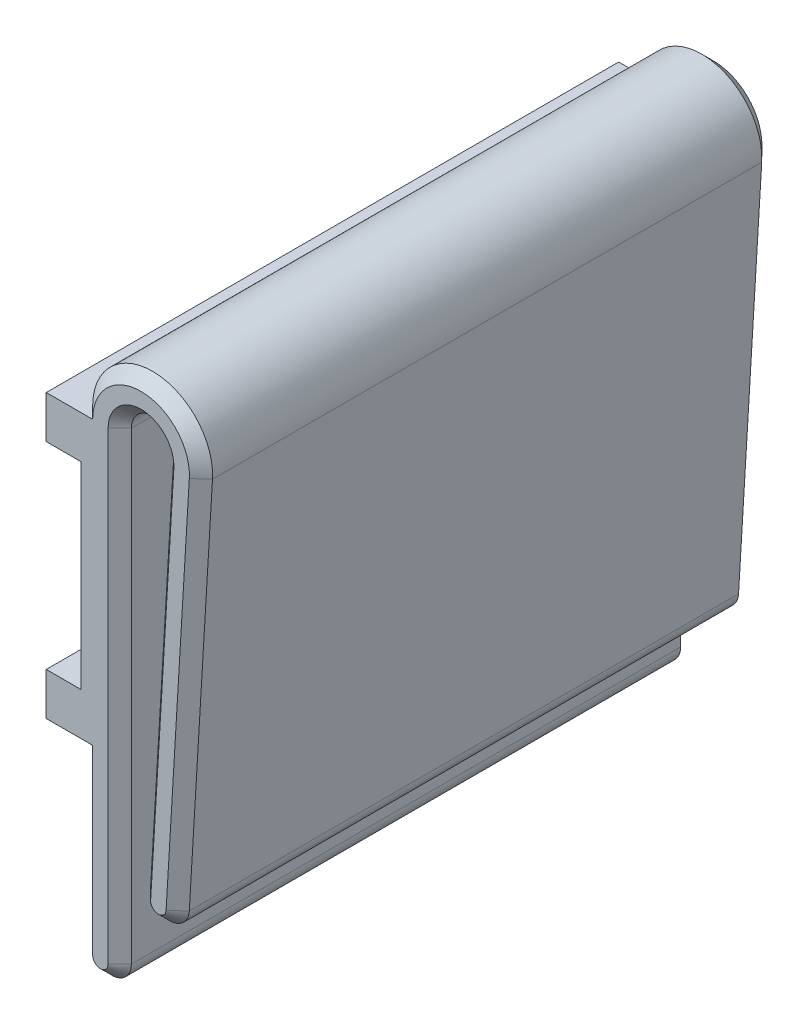
ISO-10303-21;
HEADER;
FILE_DESCRIPTION(('STEP AP214'),'2;1');
FILE_NAME('part.step','',(''),(''),'','','');
FILE_SCHEMA(('AUTOMOTIVE_DESIGN { 1 0 10303 214 1 1 1 1 }'));
ENDSEC;
DATA;
#1=APPLICATION_CONTEXT('core data for automotive mechanical design processes');
#2=APPLICATION_PROTOCOL_DEFINITION('international standard','automotive_design',2000,#1);
#3=PRODUCT_CONTEXT('',#1,'mechanical');
#4=PRODUCT('Part','Part','',(#3));
#5=PRODUCT_RELATED_PRODUCT_CATEGORY('part','',(#4));
#6=PRODUCT_DEFINITION_FORMATION('','',#4);
#7=PRODUCT_DEFINITION_CONTEXT('part definition',#1,'design');
#8=PRODUCT_DEFINITION('design','',#6,#7);
#9=PRODUCT_DEFINITION_SHAPE('','',#8);
#10=(LENGTH_UNIT() NAMED_UNIT(*) SI_UNIT(.MILLI.,.METRE.));
#11=(NAMED_UNIT(*) PLANE_ANGLE_UNIT() SI_UNIT($,.RADIAN.));
#12=(NAMED_UNIT(*) SI_UNIT($,.STERADIAN.) SOLID_ANGLE_UNIT());
#13=UNCERTAINTY_MEASURE_WITH_UNIT(LENGTH_MEASURE(1.E-05),#10,'distance_accuracy_value','');
#14=(GEOMETRIC_REPRESENTATION_CONTEXT(3) GLOBAL_UNCERTAINTY_ASSIGNED_CONTEXT((#13)) GLOBAL_UNIT_ASSIGNED_CONTEXT((#10,
#11,#12)) REPRESENTATION_CONTEXT('',''));
#15=CARTESIAN_POINT('',(0.,0.,0.));
#16=DIRECTION('',(0.,0.,1.));
#17=DIRECTION('',(1.,0.,0.));
#18=AXIS2_PLACEMENT_3D('',#15,#16,#17);
#19=CARTESIAN_POINT('',(1.09801223621644,-0.0660993881891783,14.8));
#20=DIRECTION('',(0.998192942014941,-0.060090352899253,0.));
#21=DIRECTION('',(0.060090352899253,0.998192942014941,0.));
#22=AXIS2_PLACEMENT_3D('',#19,#20,#21);
#23=PLANE('',#22);
#24=DIRECTION('',(0.,0.,-1.));
#25=VECTOR('',#24,1.);
#26=CARTESIAN_POINT('',(1.1,-0.0330795824563993,14.8));
#27=LINE('',#26,#25);
#28=CARTESIAN_POINT('',(1.1,-0.0330795824563993,14.5));
#29=VERTEX_POINT('',#28);
#30=CARTESIAN_POINT('',(1.1,-0.0330795824563993,0.299999999999998));
#31=VERTEX_POINT('',#30);
#32=EDGE_CURVE('E240',#29,#31,#27,.T.);
#33=ORIENTED_EDGE('',*,*,#32,.T.);
#34=DIRECTION('',(-0.060090352899253,-0.998192942014941,0.));
#35=VECTOR('',#34,1.);
#36=CARTESIAN_POINT('',(1.09801223621644,-0.0660993881891783,0.299999999999998));
#37=LINE('',#36,#35);
#38=CARTESIAN_POINT('',(0.5,-10.,0.299999999999998));
#39=VERTEX_POINT('',#38);
#40=EDGE_CURVE('E328',#31,#39,#37,.T.);
#41=ORIENTED_EDGE('',*,*,#40,.T.);
#42=DIRECTION('',(0.,0.,-1.));
#43=VECTOR('',#42,1.);
#44=CARTESIAN_POINT('',(0.5,-10.,14.8));
#45=LINE('',#44,#43);
#46=CARTESIAN_POINT('',(0.5,-10.,14.5));
#47=VERTEX_POINT('',#46);
#48=EDGE_CURVE('E289',#47,#39,#45,.T.);
#49=ORIENTED_EDGE('',*,*,#48,.F.);
#50=DIRECTION('',(0.060090352899253,0.998192942014941,0.));
#51=VECTOR('',#50,1.);
#52=CARTESIAN_POINT('',(1.1,-0.0330795824563992,14.5));
#53=LINE('',#52,#51);
#54=EDGE_CURVE('E326',#47,#29,#53,.T.);
#55=ORIENTED_EDGE('',*,*,#54,.T.);
#56=EDGE_LOOP('',(#33,#41,#49,#55));
#57=FACE_BOUND('',#56,.T.);
#58=ADVANCED_FACE('F41',(#57),#23,.F.);
#59=CARTESIAN_POINT('',(0.99909647100747,-10.0300451764496,14.8));
#60=DIRECTION('',(0.,0.,-1.));
#61=DIRECTION('',(-1.,0.,0.));
#62=AXIS2_PLACEMENT_3D('',#59,#60,#61);
#63=CYLINDRICAL_SURFACE('',#62,0.5);
#64=ORIENTED_EDGE('',*,*,#48,.T.);
#65=CARTESIAN_POINT('',(0.99909647100747,-10.0300451764496,0.299999999999998));
#66=DIRECTION('',(0.,0.,1.));
#67=DIRECTION('',(1.,0.,0.));
#68=AXIS2_PLACEMENT_3D('',#65,#66,#67);
#69=CIRCLE('',#68,0.5);
#70=CARTESIAN_POINT('',(1.49819294201494,-10.0600903528993,0.299999999999998));
#71=VERTEX_POINT('',#70);
#72=EDGE_CURVE('E336',#39,#71,#69,.T.);
#73=ORIENTED_EDGE('',*,*,#72,.T.);
#74=DIRECTION('',(0.,0.,-1.));
#75=VECTOR('',#74,1.);
#76=CARTESIAN_POINT('',(1.49819294201494,-10.0600903528993,14.8));
#77=LINE('',#76,#75);
#78=CARTESIAN_POINT('',(1.49819294201494,-10.0600903528993,14.5));
#79=VERTEX_POINT('',#78);
#80=EDGE_CURVE('E286',#79,#71,#77,.T.);
#81=ORIENTED_EDGE('',*,*,#80,.F.);
#82=CARTESIAN_POINT('',(0.99909647100747,-10.0300451764496,14.5));
#83=DIRECTION('',(0.,0.,1.));
#84=DIRECTION('',(1.,0.,0.));
#85=AXIS2_PLACEMENT_3D('',#82,#83,#84);
#86=CIRCLE('',#85,0.5);
#87=EDGE_CURVE('E334',#79,#47,#86,.F.);
#88=ORIENTED_EDGE('',*,*,#87,.T.);
#89=EDGE_LOOP('',(#64,#73,#81,#88));
#90=FACE_BOUND('',#89,.T.);
#91=ADVANCED_FACE('F507',(#90),#63,.T.);
#92=CARTESIAN_POINT('',(2.09620517823138,-0.126189741088431,14.8));
#93=DIRECTION('',(0.998192942014941,-0.060090352899253,0.));
#94=DIRECTION('',(0.060090352899253,0.998192942014941,0.));
#95=AXIS2_PLACEMENT_3D('',#92,#93,#94);
#96=PLANE('',#95);
#97=ORIENTED_EDGE('',*,*,#80,.T.);
#98=DIRECTION('',(0.060090352899253,0.998192942014941,0.));
#99=VECTOR('',#98,1.);
#100=CARTESIAN_POINT('',(2.09819294201494,-0.0931699353556522,0.299999999999998));
#101=LINE('',#100,#99);
#102=CARTESIAN_POINT('',(2.09819294201494,-0.0931699353556522,0.299999999999998));
#103=VERTEX_POINT('',#102);
#104=EDGE_CURVE('E340',#71,#103,#101,.T.);
#105=ORIENTED_EDGE('',*,*,#104,.T.);
#106=DIRECTION('',(0.,0.,-1.));
#107=VECTOR('',#106,1.);
#108=CARTESIAN_POINT('',(2.09819294201494,-0.0931699353556522,14.8));
#109=LINE('',#108,#107);
#110=CARTESIAN_POINT('',(2.09819294201494,-0.0931699353556522,14.5));
#111=VERTEX_POINT('',#110);
#112=EDGE_CURVE('E283',#111,#103,#109,.T.);
#113=ORIENTED_EDGE('',*,*,#112,.F.);
#114=DIRECTION('',(-0.060090352899253,-0.998192942014941,0.));
#115=VECTOR('',#114,1.);
#116=CARTESIAN_POINT('',(2.09620517823138,-0.126189741088431,14.5));
#117=LINE('',#116,#115);
#118=EDGE_CURVE('E338',#111,#79,#117,.T.);
#119=ORIENTED_EDGE('',*,*,#118,.T.);
#120=EDGE_LOOP('',(#97,#105,#113,#119));
#121=FACE_BOUND('',#120,.T.);
#122=ADVANCED_FACE('F509',(#121),#96,.T.);
#123=CARTESIAN_POINT('',(0.550497390352495,0.,14.8));
#124=DIRECTION('',(0.,0.,-1.));
#125=DIRECTION('',(-1.,0.,0.));
#126=AXIS2_PLACEMENT_3D('',#123,#124,#125);
#127=CYLINDRICAL_SURFACE('',#126,1.5504973903525);
#128=ORIENTED_EDGE('',*,*,#112,.T.);
#129=CARTESIAN_POINT('',(0.550497390352495,0.,0.299999999999998));
#130=DIRECTION('',(0.,0.,1.));
#131=DIRECTION('',(1.,0.,0.));
#132=AXIS2_PLACEMENT_3D('',#129,#130,#131);
#133=CIRCLE('',#132,1.5504973903525);
#134=CARTESIAN_POINT('',(-1.,0.,0.299999999999998));
#135=VERTEX_POINT('',#134);
#136=EDGE_CURVE('E332',#103,#135,#133,.T.);
#137=ORIENTED_EDGE('',*,*,#136,.T.);
#138=DIRECTION('',(0.,0.,-1.));
#139=VECTOR('',#138,1.);
#140=CARTESIAN_POINT('',(-1.,0.,14.8));
#141=LINE('',#140,#139);
#142=CARTESIAN_POINT('',(-1.,0.,14.5));
#143=VERTEX_POINT('',#142);
#144=EDGE_CURVE('E223',#143,#135,#141,.T.);
#145=ORIENTED_EDGE('',*,*,#144,.F.);
#146=CARTESIAN_POINT('',(0.550497390352495,0.,14.5));
#147=DIRECTION('',(0.,0.,1.));
#148=DIRECTION('',(1.,0.,0.));
#149=AXIS2_PLACEMENT_3D('',#146,#147,#148);
#150=CIRCLE('',#149,1.5504973903525);
#151=EDGE_CURVE('E330',#143,#111,#150,.F.);
#152=ORIENTED_EDGE('',*,*,#151,.T.);
#153=EDGE_LOOP('',(#128,#137,#145,#152));
#154=FACE_BOUND('',#153,.T.);
#155=ADVANCED_FACE('F410',(#154),#127,.T.);
#156=CARTESIAN_POINT('',(0.,0.,14.8));
#157=DIRECTION('',(0.,-1.,0.));
#158=DIRECTION('',(1.,0.,0.));
#159=AXIS2_PLACEMENT_3D('',#156,#157,#158);
#160=PLANE('',#159);
#161=DIRECTION('',(-1.,0.,0.));
#162=VECTOR('',#161,1.);
#163=CARTESIAN_POINT('',(0.,0.,0.));
#164=LINE('',#163,#162);
#165=CARTESIAN_POINT('',(-0.700000000000004,0.,0.));
#166=VERTEX_POINT('',#165);
#167=CARTESIAN_POINT('',(-1.9,0.,0.));
#168=VERTEX_POINT('',#167);
#169=EDGE_CURVE('E220',#166,#168,#164,.T.);
#170=ORIENTED_EDGE('',*,*,#169,.T.);
#171=DIRECTION('',(0.,0.,-1.));
#172=VECTOR('',#171,1.);
#173=CARTESIAN_POINT('',(-1.9,0.,14.8));
#174=LINE('',#173,#172);
#175=CARTESIAN_POINT('',(-1.9,0.,14.8));
#176=VERTEX_POINT('',#175);
#177=EDGE_CURVE('E217',#176,#168,#174,.T.);
#178=ORIENTED_EDGE('',*,*,#177,.F.);
#179=DIRECTION('',(-1.,0.,0.));
#180=VECTOR('',#179,1.);
#181=CARTESIAN_POINT('',(0.,0.,14.8));
#182=LINE('',#181,#180);
#183=CARTESIAN_POINT('',(-0.699999999999999,0.,14.8));
#184=VERTEX_POINT('',#183);
#185=EDGE_CURVE('E204',#184,#176,#182,.T.);
#186=ORIENTED_EDGE('',*,*,#185,.F.);
#187=DIRECTION('',(-0.707106781186549,0.,-0.707106781186546));
#188=VECTOR('',#187,1.);
#189=CARTESIAN_POINT('',(0.550497390352495,0.,16.0504973903525));
#190=LINE('',#189,#188);
#191=EDGE_CURVE('E11',#184,#143,#190,.T.);
#192=ORIENTED_EDGE('',*,*,#191,.T.);
#193=ORIENTED_EDGE('',*,*,#144,.T.);
#194=DIRECTION('',(0.707106781186545,0.,-0.70710678118655));
#195=VECTOR('',#194,1.);
#196=CARTESIAN_POINT('',(0.550497390352495,0.,-1.25049739035251));
#197=LINE('',#196,#195);
#198=EDGE_CURVE('E359',#135,#166,#197,.T.);
#199=ORIENTED_EDGE('',*,*,#198,.T.);
#200=EDGE_LOOP('',(#170,#178,#186,#192,#193,#199));
#201=FACE_BOUND('',#200,.T.);
#202=ADVANCED_FACE('F218',(#201),#160,.F.);
#203=CARTESIAN_POINT('',(-1.9,0.,14.8));
#204=DIRECTION('',(1.,0.,0.));
#205=DIRECTION('',(0.,0.,-1.));
#206=AXIS2_PLACEMENT_3D('',#203,#204,#205);
#207=PLANE('',#206);
#208=DIRECTION('',(0.,-1.,0.));
#209=VECTOR('',#208,1.);
#210=CARTESIAN_POINT('',(-1.9,0.,0.));
#211=LINE('',#210,#209);
#212=CARTESIAN_POINT('',(-1.9,-1.1,0.));
#213=VERTEX_POINT('',#212);
#214=EDGE_CURVE('E242',#168,#213,#211,.T.);
#215=ORIENTED_EDGE('',*,*,#214,.T.);
#216=DIRECTION('',(0.,0.,-1.));
#217=VECTOR('',#216,1.);
#218=CARTESIAN_POINT('',(-1.9,-1.1,14.8));
#219=LINE('',#218,#217);
#220=CARTESIAN_POINT('',(-1.9,-1.1,14.8));
#221=VERTEX_POINT('',#220);
#222=EDGE_CURVE('E224',#221,#213,#219,.T.);
#223=ORIENTED_EDGE('',*,*,#222,.F.);
#224=DIRECTION('',(0.,-1.,0.));
#225=VECTOR('',#224,1.);
#226=CARTESIAN_POINT('',(-1.9,0.,14.8));
#227=LINE('',#226,#225);
#228=EDGE_CURVE('E208',#176,#221,#227,.T.);
#229=ORIENTED_EDGE('',*,*,#228,.F.);
#230=ORIENTED_EDGE('',*,*,#177,.T.);
#231=EDGE_LOOP('',(#215,#223,#229,#230));
#232=FACE_BOUND('',#231,.T.);
#233=ADVANCED_FACE('F226',(#232),#207,.F.);
#234=CARTESIAN_POINT('',(0.,-1.1,14.8));
#235=DIRECTION('',(0.,1.,0.));
#236=DIRECTION('',(0.,0.,1.));
#237=AXIS2_PLACEMENT_3D('',#234,#235,#236);
#238=PLANE('',#237);
#239=DIRECTION('',(1.,0.,0.));
#240=VECTOR('',#239,1.);
#241=CARTESIAN_POINT('',(0.,-1.1,0.));
#242=LINE('',#241,#240);
#243=CARTESIAN_POINT('',(-1.,-1.1,0.));
#244=VERTEX_POINT('',#243);
#245=EDGE_CURVE('E245',#213,#244,#242,.T.);
#246=ORIENTED_EDGE('',*,*,#245,.T.);
#247=DIRECTION('',(0.,0.,-1.));
#248=VECTOR('',#247,1.);
#249=CARTESIAN_POINT('',(-1.,-1.1,14.8));
#250=LINE('',#249,#248);
#251=CARTESIAN_POINT('',(-1.,-1.1,14.8));
#252=VERTEX_POINT('',#251);
#253=EDGE_CURVE('E277',#252,#244,#250,.T.);
#254=ORIENTED_EDGE('',*,*,#253,.F.);
#255=DIRECTION('',(1.,0.,0.));
#256=VECTOR('',#255,1.);
#257=CARTESIAN_POINT('',(0.,-1.1,14.8));
#258=LINE('',#257,#256);
#259=EDGE_CURVE('E229',#221,#252,#258,.T.);
#260=ORIENTED_EDGE('',*,*,#259,.F.);
#261=ORIENTED_EDGE('',*,*,#222,.T.);
#262=EDGE_LOOP('',(#246,#254,#260,#261));
#263=FACE_BOUND('',#262,.T.);
#264=ADVANCED_FACE('F429',(#263),#238,.F.);
#265=CARTESIAN_POINT('',(-1.,0.,14.8));
#266=DIRECTION('',(1.,0.,0.));
#267=DIRECTION('',(0.,0.,-1.));
#268=AXIS2_PLACEMENT_3D('',#265,#266,#267);
#269=PLANE('',#268);
#270=DIRECTION('',(0.,-1.,0.));
#271=VECTOR('',#270,1.);
#272=CARTESIAN_POINT('',(-1.,0.,0.));
#273=LINE('',#272,#271);
#274=CARTESIAN_POINT('',(-1.,-6.2,0.));
#275=VERTEX_POINT('',#274);
#276=EDGE_CURVE('E247',#244,#275,#273,.T.);
#277=ORIENTED_EDGE('',*,*,#276,.T.);
#278=DIRECTION('',(0.,0.,-1.));
#279=VECTOR('',#278,1.);
#280=CARTESIAN_POINT('',(-1.,-6.2,14.8));
#281=LINE('',#280,#279);
#282=CARTESIAN_POINT('',(-1.,-6.2,14.8));
#283=VERTEX_POINT('',#282);
#284=EDGE_CURVE('E274',#283,#275,#281,.T.);
#285=ORIENTED_EDGE('',*,*,#284,.F.);
#286=DIRECTION('',(0.,-1.,0.));
#287=VECTOR('',#286,1.);
#288=CARTESIAN_POINT('',(-1.,0.,14.8));
#289=LINE('',#288,#287);
#290=EDGE_CURVE('E231',#252,#283,#289,.T.);
#291=ORIENTED_EDGE('',*,*,#290,.F.);
#292=ORIENTED_EDGE('',*,*,#253,.T.);
#293=EDGE_LOOP('',(#277,#285,#291,#292));
#294=FACE_BOUND('',#293,.T.);
#295=ADVANCED_FACE('F436',(#294),#269,.F.);
#296=CARTESIAN_POINT('',(0.,-6.2,14.8));
#297=DIRECTION('',(0.,-1.,0.));
#298=DIRECTION('',(0.,0.,-1.));
#299=AXIS2_PLACEMENT_3D('',#296,#297,#298);
#300=PLANE('',#299);
#301=DIRECTION('',(-1.,0.,0.));
#302=VECTOR('',#301,1.);
#303=CARTESIAN_POINT('',(0.,-6.2,0.));
#304=LINE('',#303,#302);
#305=CARTESIAN_POINT('',(-1.9,-6.2,0.));
#306=VERTEX_POINT('',#305);
#307=EDGE_CURVE('E249',#275,#306,#304,.T.);
#308=ORIENTED_EDGE('',*,*,#307,.T.);
#309=DIRECTION('',(0.,0.,-1.));
#310=VECTOR('',#309,1.);
#311=CARTESIAN_POINT('',(-1.9,-6.2,14.8));
#312=LINE('',#311,#310);
#313=CARTESIAN_POINT('',(-1.9,-6.2,14.8));
#314=VERTEX_POINT('',#313);
#315=EDGE_CURVE('E271',#314,#306,#312,.T.);
#316=ORIENTED_EDGE('',*,*,#315,.F.);
#317=DIRECTION('',(-1.,0.,0.));
#318=VECTOR('',#317,1.);
#319=CARTESIAN_POINT('',(0.,-6.2,14.8));
#320=LINE('',#319,#318);
#321=EDGE_CURVE('E235',#283,#314,#320,.T.);
#322=ORIENTED_EDGE('',*,*,#321,.F.);
#323=ORIENTED_EDGE('',*,*,#284,.T.);
#324=EDGE_LOOP('',(#308,#316,#322,#323));
#325=FACE_BOUND('',#324,.T.);
#326=ADVANCED_FACE('F439',(#325),#300,.F.);
#327=CARTESIAN_POINT('',(-1.9,0.,14.8));
#328=DIRECTION('',(1.,0.,0.));
#329=DIRECTION('',(0.,1.,0.));
#330=AXIS2_PLACEMENT_3D('',#327,#328,#329);
#331=PLANE('',#330);
#332=DIRECTION('',(0.,-1.,0.));
#333=VECTOR('',#332,1.);
#334=CARTESIAN_POINT('',(-1.9,0.,0.));
#335=LINE('',#334,#333);
#336=CARTESIAN_POINT('',(-1.9,-7.3,0.));
#337=VERTEX_POINT('',#336);
#338=EDGE_CURVE('E251',#306,#337,#335,.T.);
#339=ORIENTED_EDGE('',*,*,#338,.T.);
#340=DIRECTION('',(0.,0.,-1.));
#341=VECTOR('',#340,1.);
#342=CARTESIAN_POINT('',(-1.9,-7.3,14.8));
#343=LINE('',#342,#341);
#344=CARTESIAN_POINT('',(-1.9,-7.3,14.8));
#345=VERTEX_POINT('',#344);
#346=EDGE_CURVE('E268',#345,#337,#343,.T.);
#347=ORIENTED_EDGE('',*,*,#346,.F.);
#348=DIRECTION('',(0.,-1.,0.));
#349=VECTOR('',#348,1.);
#350=CARTESIAN_POINT('',(-1.9,0.,14.8));
#351=LINE('',#350,#349);
#352=EDGE_CURVE('E237',#314,#345,#351,.T.);
#353=ORIENTED_EDGE('',*,*,#352,.F.);
#354=ORIENTED_EDGE('',*,*,#315,.T.);
#355=EDGE_LOOP('',(#339,#347,#353,#354));
#356=FACE_BOUND('',#355,.T.);
#357=ADVANCED_FACE('F444',(#356),#331,.F.);
#358=CARTESIAN_POINT('',(0.,-7.3,14.8));
#359=DIRECTION('',(0.,1.,0.));
#360=DIRECTION('',(0.,0.,1.));
#361=AXIS2_PLACEMENT_3D('',#358,#359,#360);
#362=PLANE('',#361);
#363=DIRECTION('',(1.,0.,0.));
#364=VECTOR('',#363,1.);
#365=CARTESIAN_POINT('',(0.,-7.3,0.));
#366=LINE('',#365,#364);
#367=CARTESIAN_POINT('',(-0.700000000000004,-7.3,0.));
#368=VERTEX_POINT('',#367);
#369=EDGE_CURVE('E214',#337,#368,#366,.T.);
#370=ORIENTED_EDGE('',*,*,#369,.T.);
#371=DIRECTION('',(0.707106781186545,0.,-0.70710678118655));
#372=VECTOR('',#371,1.);
#373=CARTESIAN_POINT('',(-7.75000000000001,-7.3,7.05000000000005));
#374=LINE('',#373,#372);
#375=CARTESIAN_POINT('',(-1.,-7.3,0.299999999999998));
#376=VERTEX_POINT('',#375);
#377=EDGE_CURVE('E357',#368,#376,#374,.F.);
#378=ORIENTED_EDGE('',*,*,#377,.T.);
#379=DIRECTION('',(0.,0.,-1.));
#380=VECTOR('',#379,1.);
#381=CARTESIAN_POINT('',(-1.,-7.3,14.8));
#382=LINE('',#381,#380);
#383=CARTESIAN_POINT('',(-1.,-7.3,14.5));
#384=VERTEX_POINT('',#383);
#385=EDGE_CURVE('E265',#384,#376,#382,.T.);
#386=ORIENTED_EDGE('',*,*,#385,.F.);
#387=DIRECTION('',(0.707106781186549,0.,0.707106781186546));
#388=VECTOR('',#387,1.);
#389=CARTESIAN_POINT('',(-0.349999999999997,-7.3,15.15));
#390=LINE('',#389,#388);
#391=CARTESIAN_POINT('',(-0.699999999999999,-7.3,14.8));
#392=VERTEX_POINT('',#391);
#393=EDGE_CURVE('E50',#384,#392,#390,.T.);
#394=ORIENTED_EDGE('',*,*,#393,.T.);
#395=DIRECTION('',(1.,0.,0.));
#396=VECTOR('',#395,1.);
#397=CARTESIAN_POINT('',(0.,-7.3,14.8));
#398=LINE('',#397,#396);
#399=EDGE_CURVE('E58',#345,#392,#398,.T.);
#400=ORIENTED_EDGE('',*,*,#399,.F.);
#401=ORIENTED_EDGE('',*,*,#346,.T.);
#402=EDGE_LOOP('',(#370,#378,#386,#394,#400,#401));
#403=FACE_BOUND('',#402,.T.);
#404=ADVANCED_FACE('F447',(#403),#362,.F.);
#405=ORIENTED_EDGE('',*,*,#385,.T.);
#406=DIRECTION('',(0.,-1.,0.));
#407=VECTOR('',#406,1.);
#408=CARTESIAN_POINT('',(-1.,0.,0.299999999999998));
#409=LINE('',#408,#407);
#410=CARTESIAN_POINT('',(-1.,-12.,0.299999999999998));
#411=VERTEX_POINT('',#410);
#412=EDGE_CURVE('E294',#376,#411,#409,.T.);
#413=ORIENTED_EDGE('',*,*,#412,.T.);
#414=DIRECTION('',(0.,0.,-1.));
#415=VECTOR('',#414,1.);
#416=CARTESIAN_POINT('',(-1.,-12.,14.8));
#417=LINE('',#416,#415);
#418=CARTESIAN_POINT('',(-1.,-12.,14.5));
#419=VERTEX_POINT('',#418);
#420=EDGE_CURVE('E262',#419,#411,#417,.T.);
#421=ORIENTED_EDGE('',*,*,#420,.F.);
#422=DIRECTION('',(0.,1.,0.));
#423=VECTOR('',#422,1.);
#424=CARTESIAN_POINT('',(-1.,-7.3,14.5));
#425=LINE('',#424,#423);
#426=EDGE_CURVE('E292',#419,#384,#425,.T.);
#427=ORIENTED_EDGE('',*,*,#426,.T.);
#428=EDGE_LOOP('',(#405,#413,#421,#427));
#429=FACE_BOUND('',#428,.T.);
#430=ADVANCED_FACE('F466',(#429),#269,.F.);
#431=CARTESIAN_POINT('',(-0.499999999999999,-12.,14.8));
#432=DIRECTION('',(0.,0.,-1.));
#433=DIRECTION('',(-1.,0.,0.));
#434=AXIS2_PLACEMENT_3D('',#431,#432,#433);
#435=CYLINDRICAL_SURFACE('',#434,0.500000000000001);
#436=ORIENTED_EDGE('',*,*,#420,.T.);
#437=CARTESIAN_POINT('',(-0.499999999999999,-12.,0.299999999999998));
#438=DIRECTION('',(0.,0.,1.));
#439=DIRECTION('',(1.,0.,0.));
#440=AXIS2_PLACEMENT_3D('',#437,#438,#439);
#441=CIRCLE('',#440,0.500000000000001);
#442=CARTESIAN_POINT('',(0.,-12.,0.299999999999998));
#443=VERTEX_POINT('',#442);
#444=EDGE_CURVE('E316',#411,#443,#441,.T.);
#445=ORIENTED_EDGE('',*,*,#444,.T.);
#446=DIRECTION('',(0.,0.,-1.));
#447=VECTOR('',#446,1.);
#448=CARTESIAN_POINT('',(0.,-12.,14.8));
#449=LINE('',#448,#447);
#450=CARTESIAN_POINT('',(0.,-12.,14.5));
#451=VERTEX_POINT('',#450);
#452=EDGE_CURVE('E259',#451,#443,#449,.T.);
#453=ORIENTED_EDGE('',*,*,#452,.F.);
#454=CARTESIAN_POINT('',(-0.499999999999999,-12.,14.5));
#455=DIRECTION('',(0.,0.,1.));
#456=DIRECTION('',(1.,0.,0.));
#457=AXIS2_PLACEMENT_3D('',#454,#455,#456);
#458=CIRCLE('',#457,0.500000000000001);
#459=EDGE_CURVE('E314',#451,#419,#458,.F.);
#460=ORIENTED_EDGE('',*,*,#459,.T.);
#461=EDGE_LOOP('',(#436,#445,#453,#460));
#462=FACE_BOUND('',#461,.T.);
#463=ADVANCED_FACE('F464',(#462),#435,.T.);
#464=CARTESIAN_POINT('',(0.,0.,14.8));
#465=DIRECTION('',(1.,0.,0.));
#466=DIRECTION('',(0.,1.,0.));
#467=AXIS2_PLACEMENT_3D('',#464,#465,#466);
#468=PLANE('',#467);
#469=ORIENTED_EDGE('',*,*,#452,.T.);
#470=DIRECTION('',(0.,1.,0.));
#471=VECTOR('',#470,1.);
#472=CARTESIAN_POINT('',(0.,0.,0.299999999999998));
#473=LINE('',#472,#471);
#474=CARTESIAN_POINT('',(0.,0.,0.299999999999998));
#475=VERTEX_POINT('',#474);
#476=EDGE_CURVE('E320',#443,#475,#473,.T.);
#477=ORIENTED_EDGE('',*,*,#476,.T.);
#478=DIRECTION('',(0.,0.,-1.));
#479=VECTOR('',#478,1.);
#480=CARTESIAN_POINT('',(0.,0.,14.8));
#481=LINE('',#480,#479);
#482=CARTESIAN_POINT('',(0.,0.,14.5));
#483=VERTEX_POINT('',#482);
#484=EDGE_CURVE('E256',#483,#475,#481,.T.);
#485=ORIENTED_EDGE('',*,*,#484,.F.);
#486=DIRECTION('',(0.,-1.,0.));
#487=VECTOR('',#486,1.);
#488=CARTESIAN_POINT('',(0.,0.,14.5));
#489=LINE('',#488,#487);
#490=EDGE_CURVE('E318',#483,#451,#489,.T.);
#491=ORIENTED_EDGE('',*,*,#490,.T.);
#492=EDGE_LOOP('',(#469,#477,#485,#491));
#493=FACE_BOUND('',#492,.T.);
#494=ADVANCED_FACE('F480',(#493),#468,.T.);
#495=CARTESIAN_POINT('',(0.550497390352495,0.,14.8));
#496=DIRECTION('',(0.,0.,-1.));
#497=DIRECTION('',(-1.,0.,0.));
#498=AXIS2_PLACEMENT_3D('',#495,#496,#497);
#499=CYLINDRICAL_SURFACE('',#498,0.550497390352495);
#500=ORIENTED_EDGE('',*,*,#484,.T.);
#501=CARTESIAN_POINT('',(0.550497390352495,0.,0.299999999999998));
#502=DIRECTION('',(0.,0.,1.));
#503=DIRECTION('',(1.,0.,0.));
#504=AXIS2_PLACEMENT_3D('',#501,#502,#503);
#505=CIRCLE('',#504,0.550497390352495);
#506=EDGE_CURVE('E324',#475,#31,#505,.F.);
#507=ORIENTED_EDGE('',*,*,#506,.T.);
#508=ORIENTED_EDGE('',*,*,#32,.F.);
#509=CARTESIAN_POINT('',(0.550497390352495,0.,14.5));
#510=DIRECTION('',(0.,0.,1.));
#511=DIRECTION('',(1.,0.,0.));
#512=AXIS2_PLACEMENT_3D('',#509,#510,#511);
#513=CIRCLE('',#512,0.550497390352495);
#514=EDGE_CURVE('E322',#29,#483,#513,.T.);
#515=ORIENTED_EDGE('',*,*,#514,.T.);
#516=EDGE_LOOP('',(#500,#507,#508,#515));
#517=FACE_BOUND('',#516,.T.);
#518=ADVANCED_FACE('F493',(#517),#499,.F.);
#519=CARTESIAN_POINT('',(0.,0.,14.8));
#520=DIRECTION('',(0.,0.,1.));
#521=DIRECTION('',(1.,0.,0.));
#522=AXIS2_PLACEMENT_3D('',#519,#520,#521);
#523=PLANE('',#522);
#524=ORIENTED_EDGE('',*,*,#399,.T.);
#525=DIRECTION('',(0.,-1.,0.));
#526=VECTOR('',#525,1.);
#527=CARTESIAN_POINT('',(-0.699999999999999,-12.,14.8));
#528=LINE('',#527,#526);
#529=CARTESIAN_POINT('',(-0.699999999999999,-12.,14.8));
#530=VERTEX_POINT('',#529);
#531=EDGE_CURVE('E355',#392,#530,#528,.T.);
#532=ORIENTED_EDGE('',*,*,#531,.T.);
#533=CARTESIAN_POINT('',(-0.499999999999999,-12.,14.8));
#534=DIRECTION('',(0.,0.,1.));
#535=DIRECTION('',(1.,0.,0.));
#536=AXIS2_PLACEMENT_3D('',#533,#534,#535);
#537=CIRCLE('',#536,0.199999999999999);
#538=CARTESIAN_POINT('',(-0.3,-12.,14.8));
#539=VERTEX_POINT('',#538);
#540=EDGE_CURVE('E353',#530,#539,#537,.T.);
#541=ORIENTED_EDGE('',*,*,#540,.T.);
#542=DIRECTION('',(0.,1.,0.));
#543=VECTOR('',#542,1.);
#544=CARTESIAN_POINT('',(-0.300000000000002,0.,14.8));
#545=LINE('',#544,#543);
#546=CARTESIAN_POINT('',(-0.300000000000001,0.,14.8));
#547=VERTEX_POINT('',#546);
#548=EDGE_CURVE('E351',#539,#547,#545,.T.);
#549=ORIENTED_EDGE('',*,*,#548,.T.);
#550=CARTESIAN_POINT('',(0.550497390352495,0.,14.8));
#551=DIRECTION('',(0.,0.,1.));
#552=DIRECTION('',(1.,0.,0.));
#553=AXIS2_PLACEMENT_3D('',#550,#551,#552);
#554=CIRCLE('',#553,0.850497390352497);
#555=CARTESIAN_POINT('',(1.39945788260448,-0.0511066883261752,14.8));
#556=VERTEX_POINT('',#555);
#557=EDGE_CURVE('E349',#547,#556,#554,.F.);
#558=ORIENTED_EDGE('',*,*,#557,.T.);
#559=DIRECTION('',(-0.060090352899253,-0.998192942014941,0.));
#560=VECTOR('',#559,1.);
#561=CARTESIAN_POINT('',(0.799457882604484,-10.0180271058698,14.8));
#562=LINE('',#561,#560);
#563=CARTESIAN_POINT('',(0.799457882604483,-10.0180271058698,14.8));
#564=VERTEX_POINT('',#563);
#565=EDGE_CURVE('E347',#556,#564,#562,.T.);
#566=ORIENTED_EDGE('',*,*,#565,.T.);
#567=CARTESIAN_POINT('',(0.99909647100747,-10.0300451764496,14.8));
#568=DIRECTION('',(0.,0.,1.));
#569=DIRECTION('',(1.,0.,0.));
#570=AXIS2_PLACEMENT_3D('',#567,#568,#569);
#571=CIRCLE('',#570,0.199999999999999);
#572=CARTESIAN_POINT('',(1.19873505941046,-10.0420632470295,14.8));
#573=VERTEX_POINT('',#572);
#574=EDGE_CURVE('E344',#564,#573,#571,.T.);
#575=ORIENTED_EDGE('',*,*,#574,.T.);
#576=DIRECTION('',(0.060090352899253,0.998192942014941,0.));
#577=VECTOR('',#576,1.);
#578=CARTESIAN_POINT('',(1.79674729562689,-0.108162635218655,14.8));
#579=LINE('',#578,#577);
#580=CARTESIAN_POINT('',(1.79873505941046,-0.0751428294858763,14.8));
#581=VERTEX_POINT('',#580);
#582=EDGE_CURVE('E342',#573,#581,#579,.T.);
#583=ORIENTED_EDGE('',*,*,#582,.T.);
#584=CARTESIAN_POINT('',(0.550497390352495,0.,14.8));
#585=DIRECTION('',(0.,0.,1.));
#586=DIRECTION('',(1.,0.,0.));
#587=AXIS2_PLACEMENT_3D('',#584,#585,#586);
#588=CIRCLE('',#587,1.25049739035249);
#589=EDGE_CURVE('E211',#581,#184,#588,.T.);
#590=ORIENTED_EDGE('',*,*,#589,.T.);
#591=ORIENTED_EDGE('',*,*,#185,.T.);
#592=ORIENTED_EDGE('',*,*,#228,.T.);
#593=ORIENTED_EDGE('',*,*,#259,.T.);
#594=ORIENTED_EDGE('',*,*,#290,.T.);
#595=ORIENTED_EDGE('',*,*,#321,.T.);
#596=ORIENTED_EDGE('',*,*,#352,.T.);
#597=EDGE_LOOP('',(#524,#532,#541,#549,#558,#566,#575,#583,#590,#591,#592,#593,#594,#595,#596));
#598=FACE_BOUND('',#597,.T.);
#599=ADVANCED_FACE('F206',(#598),#523,.T.);
#600=CARTESIAN_POINT('',(0.,0.,0.));
#601=DIRECTION('',(0.,0.,1.));
#602=DIRECTION('',(1.,0.,0.));
#603=AXIS2_PLACEMENT_3D('',#600,#601,#602);
#604=PLANE('',#603);
#605=DIRECTION('',(0.,1.,0.));
#606=VECTOR('',#605,1.);
#607=CARTESIAN_POINT('',(-0.700000000000004,0.,0.));
#608=LINE('',#607,#606);
#609=CARTESIAN_POINT('',(-0.700000000000004,-12.,0.));
#610=VERTEX_POINT('',#609);
#611=EDGE_CURVE('E311',#610,#368,#608,.T.);
#612=ORIENTED_EDGE('',*,*,#611,.T.);
#613=ORIENTED_EDGE('',*,*,#369,.F.);
#614=ORIENTED_EDGE('',*,*,#338,.F.);
#615=ORIENTED_EDGE('',*,*,#307,.F.);
#616=ORIENTED_EDGE('',*,*,#276,.F.);
#617=ORIENTED_EDGE('',*,*,#245,.F.);
#618=ORIENTED_EDGE('',*,*,#214,.F.);
#619=ORIENTED_EDGE('',*,*,#169,.F.);
#620=CARTESIAN_POINT('',(0.550497390352495,0.,0.));
#621=DIRECTION('',(0.,0.,1.));
#622=DIRECTION('',(1.,0.,0.));
#623=AXIS2_PLACEMENT_3D('',#620,#621,#622);
#624=CIRCLE('',#623,1.2504973903525);
#625=CARTESIAN_POINT('',(1.79873505941046,-0.0751428294858766,0.));
#626=VERTEX_POINT('',#625);
#627=EDGE_CURVE('E301',#166,#626,#624,.F.);
#628=ORIENTED_EDGE('',*,*,#627,.T.);
#629=DIRECTION('',(-0.060090352899253,-0.998192942014941,0.));
#630=VECTOR('',#629,1.);
#631=CARTESIAN_POINT('',(1.19873505941046,-10.0420632470295,0.));
#632=LINE('',#631,#630);
#633=CARTESIAN_POINT('',(1.19873505941046,-10.0420632470295,0.));
#634=VERTEX_POINT('',#633);
#635=EDGE_CURVE('E297',#626,#634,#632,.T.);
#636=ORIENTED_EDGE('',*,*,#635,.T.);
#637=CARTESIAN_POINT('',(0.99909647100747,-10.0300451764496,0.));
#638=DIRECTION('',(0.,0.,1.));
#639=DIRECTION('',(1.,0.,0.));
#640=AXIS2_PLACEMENT_3D('',#637,#638,#639);
#641=CIRCLE('',#640,0.200000000000004);
#642=CARTESIAN_POINT('',(0.799457882604478,-10.0180271058698,0.));
#643=VERTEX_POINT('',#642);
#644=EDGE_CURVE('E299',#634,#643,#641,.F.);
#645=ORIENTED_EDGE('',*,*,#644,.T.);
#646=DIRECTION('',(0.060090352899253,0.998192942014941,0.));
#647=VECTOR('',#646,1.);
#648=CARTESIAN_POINT('',(1.39747011882091,-0.0841264940589539,0.));
#649=LINE('',#648,#647);
#650=CARTESIAN_POINT('',(1.39945788260448,-0.0511066883261749,0.));
#651=VERTEX_POINT('',#650);
#652=EDGE_CURVE('E303',#643,#651,#649,.T.);
#653=ORIENTED_EDGE('',*,*,#652,.T.);
#654=CARTESIAN_POINT('',(0.550497390352495,0.,0.));
#655=DIRECTION('',(0.,0.,1.));
#656=DIRECTION('',(1.,0.,0.));
#657=AXIS2_PLACEMENT_3D('',#654,#655,#656);
#658=CIRCLE('',#657,0.850497390352492);
#659=CARTESIAN_POINT('',(-0.299999999999996,0.,0.));
#660=VERTEX_POINT('',#659);
#661=EDGE_CURVE('E305',#651,#660,#658,.T.);
#662=ORIENTED_EDGE('',*,*,#661,.T.);
#663=DIRECTION('',(0.,-1.,0.));
#664=VECTOR('',#663,1.);
#665=CARTESIAN_POINT('',(-0.299999999999995,-12.,0.));
#666=LINE('',#665,#664);
#667=CARTESIAN_POINT('',(-0.299999999999995,-12.,0.));
#668=VERTEX_POINT('',#667);
#669=EDGE_CURVE('E307',#660,#668,#666,.T.);
#670=ORIENTED_EDGE('',*,*,#669,.T.);
#671=CARTESIAN_POINT('',(-0.499999999999999,-12.,0.));
#672=DIRECTION('',(0.,0.,1.));
#673=DIRECTION('',(1.,0.,0.));
#674=AXIS2_PLACEMENT_3D('',#671,#672,#673);
#675=CIRCLE('',#674,0.200000000000005);
#676=EDGE_CURVE('E309',#668,#610,#675,.F.);
#677=ORIENTED_EDGE('',*,*,#676,.T.);
#678=EDGE_LOOP('',(#612,#613,#614,#615,#616,#617,#618,#619,#628,#636,#645,#653,#662,#670,#677));
#679=FACE_BOUND('',#678,.T.);
#680=ADVANCED_FACE('F424',(#679),#604,.F.);
#681=CARTESIAN_POINT('',(0.550497390352495,0.,0.));
#682=DIRECTION('',(0.,0.,1.));
#683=DIRECTION('',(1.,0.,0.));
#684=AXIS2_PLACEMENT_3D('',#681,#682,#683);
#685=CONICAL_SURFACE('',#684,1.2504973903525,0.785398163397445);
#686=ORIENTED_EDGE('',*,*,#198,.F.);
#687=ORIENTED_EDGE('',*,*,#136,.F.);
#688=DIRECTION('',(0.705828998231313,-0.0424902960189544,0.70710678118655));
#689=VECTOR('',#688,1.);
#690=CARTESIAN_POINT('',(1.79873505941046,-0.0751428294858766,0.));
#691=LINE('',#690,#689);
#692=EDGE_CURVE('E243',#626,#103,#691,.T.);
#693=ORIENTED_EDGE('',*,*,#692,.F.);
#694=ORIENTED_EDGE('',*,*,#627,.F.);
#695=EDGE_LOOP('',(#686,#687,#693,#694));
#696=FACE_BOUND('',#695,.T.);
#697=ADVANCED_FACE('F415',(#696),#685,.T.);
#698=CARTESIAN_POINT('',(1.7967472956269,-0.108162635218656,0.));
#699=DIRECTION('',(0.705828998231317,-0.0424902960189546,-0.707106781186545));
#700=DIRECTION('',(0.060090352899253,0.998192942014941,0.));
#701=AXIS2_PLACEMENT_3D('',#698,#699,#700);
#702=PLANE('',#701);
#703=ORIENTED_EDGE('',*,*,#692,.T.);
#704=ORIENTED_EDGE('',*,*,#104,.F.);
#705=DIRECTION('',(0.705828998231313,-0.042490296018957,0.70710678118655));
#706=VECTOR('',#705,1.);
#707=CARTESIAN_POINT('',(1.19873505941046,-10.0420632470295,0.));
#708=LINE('',#707,#706);
#709=EDGE_CURVE('E376',#634,#71,#708,.T.);
#710=ORIENTED_EDGE('',*,*,#709,.F.);
#711=ORIENTED_EDGE('',*,*,#635,.F.);
#712=EDGE_LOOP('',(#703,#704,#710,#711));
#713=FACE_BOUND('',#712,.T.);
#714=ADVANCED_FACE('F420',(#713),#702,.T.);
#715=CARTESIAN_POINT('',(0.99909647100747,-10.0300451764496,0.299999999999998));
#716=DIRECTION('',(0.,0.,1.));
#717=DIRECTION('',(1.,0.,0.));
#718=AXIS2_PLACEMENT_3D('',#715,#716,#717);
#719=CONICAL_SURFACE('',#718,0.5,0.785398163397445);
#720=ORIENTED_EDGE('',*,*,#709,.T.);
#721=ORIENTED_EDGE('',*,*,#72,.F.);
#722=DIRECTION('',(-0.705828998231313,0.042490296018953,0.70710678118655));
#723=VECTOR('',#722,1.);
#724=CARTESIAN_POINT('',(0.799457882604478,-10.0180271058698,0.));
#725=LINE('',#724,#723);
#726=EDGE_CURVE('E373',#643,#39,#725,.T.);
#727=ORIENTED_EDGE('',*,*,#726,.F.);
#728=ORIENTED_EDGE('',*,*,#644,.F.);
#729=EDGE_LOOP('',(#720,#721,#727,#728));
#730=FACE_BOUND('',#729,.T.);
#731=ADVANCED_FACE('F504',(#730),#719,.T.);
#732=CARTESIAN_POINT('',(1.09801223621644,-0.0660993881891783,0.299999999999998));
#733=DIRECTION('',(0.705828998231317,-0.0424902960189546,0.707106781186545));
#734=DIRECTION('',(-0.060090352899253,-0.998192942014941,0.));
#735=AXIS2_PLACEMENT_3D('',#732,#733,#734);
#736=PLANE('',#735);
#737=ORIENTED_EDGE('',*,*,#726,.T.);
#738=ORIENTED_EDGE('',*,*,#40,.F.);
#739=DIRECTION('',(-0.705828998231313,0.0424902960189544,0.70710678118655));
#740=VECTOR('',#739,1.);
#741=CARTESIAN_POINT('',(1.39945788260448,-0.0511066883261749,0.));
#742=LINE('',#741,#740);
#743=EDGE_CURVE('E370',#651,#31,#742,.T.);
#744=ORIENTED_EDGE('',*,*,#743,.F.);
#745=ORIENTED_EDGE('',*,*,#652,.F.);
#746=EDGE_LOOP('',(#737,#738,#744,#745));
#747=FACE_BOUND('',#746,.T.);
#748=ADVANCED_FACE('F500',(#747),#736,.F.);
#749=CARTESIAN_POINT('',(0.550497390352495,0.,0.299999999999998));
#750=DIRECTION('',(0.,0.,-1.));
#751=DIRECTION('',(-1.,0.,0.));
#752=AXIS2_PLACEMENT_3D('',#749,#750,#751);
#753=CONICAL_SURFACE('',#752,0.550497390352495,0.785398163397445);
#754=ORIENTED_EDGE('',*,*,#743,.T.);
#755=ORIENTED_EDGE('',*,*,#506,.F.);
#756=DIRECTION('',(0.707106781186545,0.,0.70710678118655));
#757=VECTOR('',#756,1.);
#758=CARTESIAN_POINT('',(-0.299999999999996,0.,0.));
#759=LINE('',#758,#757);
#760=EDGE_CURVE('E367',#660,#475,#759,.T.);
#761=ORIENTED_EDGE('',*,*,#760,.F.);
#762=ORIENTED_EDGE('',*,*,#661,.F.);
#763=EDGE_LOOP('',(#754,#755,#761,#762));
#764=FACE_BOUND('',#763,.T.);
#765=ADVANCED_FACE('F489',(#764),#753,.F.);
#766=CARTESIAN_POINT('',(-0.299999999999996,0.,0.));
#767=DIRECTION('',(0.70710678118655,0.,-0.707106781186545));
#768=DIRECTION('',(0.,1.,0.));
#769=AXIS2_PLACEMENT_3D('',#766,#767,#768);
#770=PLANE('',#769);
#771=ORIENTED_EDGE('',*,*,#760,.T.);
#772=ORIENTED_EDGE('',*,*,#476,.F.);
#773=DIRECTION('',(0.707106781186545,0.,0.70710678118655));
#774=VECTOR('',#773,1.);
#775=CARTESIAN_POINT('',(-0.299999999999995,-12.,0.));
#776=LINE('',#775,#774);
#777=EDGE_CURVE('E364',#668,#443,#776,.T.);
#778=ORIENTED_EDGE('',*,*,#777,.F.);
#779=ORIENTED_EDGE('',*,*,#669,.F.);
#780=EDGE_LOOP('',(#771,#772,#778,#779));
#781=FACE_BOUND('',#780,.T.);
#782=ADVANCED_FACE('F483',(#781),#770,.T.);
#783=CARTESIAN_POINT('',(-0.499999999999999,-12.,0.299999999999998));
#784=DIRECTION('',(0.,0.,1.));
#785=DIRECTION('',(1.,0.,0.));
#786=AXIS2_PLACEMENT_3D('',#783,#784,#785);
#787=CONICAL_SURFACE('',#786,0.500000000000001,0.785398163397445);
#788=ORIENTED_EDGE('',*,*,#777,.T.);
#789=ORIENTED_EDGE('',*,*,#444,.F.);
#790=DIRECTION('',(-0.707106781186545,0.,0.70710678118655));
#791=VECTOR('',#790,1.);
#792=CARTESIAN_POINT('',(-0.700000000000004,-12.,0.));
#793=LINE('',#792,#791);
#794=EDGE_CURVE('E362',#610,#411,#793,.T.);
#795=ORIENTED_EDGE('',*,*,#794,.F.);
#796=ORIENTED_EDGE('',*,*,#676,.F.);
#797=EDGE_LOOP('',(#788,#789,#795,#796));
#798=FACE_BOUND('',#797,.T.);
#799=ADVANCED_FACE('F476',(#798),#787,.T.);
#800=CARTESIAN_POINT('',(-1.,0.,0.299999999999998));
#801=DIRECTION('',(0.70710678118655,0.,0.707106781186545));
#802=DIRECTION('',(0.,-1.,0.));
#803=AXIS2_PLACEMENT_3D('',#800,#801,#802);
#804=PLANE('',#803);
#805=ORIENTED_EDGE('',*,*,#377,.F.);
#806=ORIENTED_EDGE('',*,*,#611,.F.);
#807=ORIENTED_EDGE('',*,*,#794,.T.);
#808=ORIENTED_EDGE('',*,*,#412,.F.);
#809=EDGE_LOOP('',(#805,#806,#807,#808));
#810=FACE_BOUND('',#809,.T.);
#811=ADVANCED_FACE('F470',(#810),#804,.F.);
#812=CARTESIAN_POINT('',(0.550497390352495,0.,14.5));
#813=DIRECTION('',(0.,0.,-1.));
#814=DIRECTION('',(-1.,0.,0.));
#815=AXIS2_PLACEMENT_3D('',#812,#813,#814);
#816=CONICAL_SURFACE('',#815,1.5504973903525,0.785398163397451);
#817=ORIENTED_EDGE('',*,*,#191,.F.);
#818=ORIENTED_EDGE('',*,*,#589,.F.);
#819=DIRECTION('',(-0.705828998231317,0.0424902960189546,0.707106781186545));
#820=VECTOR('',#819,1.);
#821=CARTESIAN_POINT('',(2.09819294201494,-0.0931699353556522,14.5));
#822=LINE('',#821,#820);
#823=EDGE_CURVE('E45',#111,#581,#822,.T.);
#824=ORIENTED_EDGE('',*,*,#823,.F.);
#825=ORIENTED_EDGE('',*,*,#151,.F.);
#826=EDGE_LOOP('',(#817,#818,#824,#825));
#827=FACE_BOUND('',#826,.T.);
#828=ADVANCED_FACE('F43',(#827),#816,.T.);
#829=CARTESIAN_POINT('',(2.09620517823138,-0.126189741088431,14.5));
#830=DIRECTION('',(-0.705828998231313,0.0424902960189544,-0.707106781186549));
#831=DIRECTION('',(-0.060090352899253,-0.998192942014941,0.));
#832=AXIS2_PLACEMENT_3D('',#829,#830,#831);
#833=PLANE('',#832);
#834=ORIENTED_EDGE('',*,*,#823,.T.);
#835=ORIENTED_EDGE('',*,*,#582,.F.);
#836=DIRECTION('',(-0.705828998231317,0.0424902960189566,0.707106781186546));
#837=VECTOR('',#836,1.);
#838=CARTESIAN_POINT('',(1.49819294201494,-10.0600903528993,14.5));
#839=LINE('',#838,#837);
#840=EDGE_CURVE('E393',#79,#573,#839,.T.);
#841=ORIENTED_EDGE('',*,*,#840,.F.);
#842=ORIENTED_EDGE('',*,*,#118,.F.);
#843=EDGE_LOOP('',(#834,#835,#841,#842));
#844=FACE_BOUND('',#843,.T.);
#845=ADVANCED_FACE('F404',(#844),#833,.F.);
#846=CARTESIAN_POINT('',(0.99909647100747,-10.0300451764496,14.8));
#847=DIRECTION('',(0.,0.,-1.));
#848=DIRECTION('',(-1.,0.,0.));
#849=AXIS2_PLACEMENT_3D('',#846,#847,#848);
#850=CONICAL_SURFACE('',#849,0.199999999999999,0.785398163397451);
#851=ORIENTED_EDGE('',*,*,#840,.T.);
#852=ORIENTED_EDGE('',*,*,#574,.F.);
#853=DIRECTION('',(0.705828998231317,-0.0424902960189565,0.707106781186546));
#854=VECTOR('',#853,1.);
#855=CARTESIAN_POINT('',(0.5,-10.,14.5));
#856=LINE('',#855,#854);
#857=EDGE_CURVE('E391',#47,#564,#856,.T.);
#858=ORIENTED_EDGE('',*,*,#857,.F.);
#859=ORIENTED_EDGE('',*,*,#87,.F.);
#860=EDGE_LOOP('',(#851,#852,#858,#859));
#861=FACE_BOUND('',#860,.T.);
#862=ADVANCED_FACE('F553',(#861),#850,.T.);
#863=CARTESIAN_POINT('',(1.39747011882092,-0.0841264940589542,14.8));
#864=DIRECTION('',(-0.705828998231313,0.0424902960189544,0.707106781186549));
#865=DIRECTION('',(0.060090352899253,0.998192942014941,0.));
#866=AXIS2_PLACEMENT_3D('',#863,#864,#865);
#867=PLANE('',#866);
#868=ORIENTED_EDGE('',*,*,#857,.T.);
#869=ORIENTED_EDGE('',*,*,#565,.F.);
#870=DIRECTION('',(0.705828998231317,-0.0424902960189546,0.707106781186546));
#871=VECTOR('',#870,1.);
#872=CARTESIAN_POINT('',(1.1,-0.0330795824563993,14.5));
#873=LINE('',#872,#871);
#874=EDGE_CURVE('E388',#29,#556,#873,.T.);
#875=ORIENTED_EDGE('',*,*,#874,.F.);
#876=ORIENTED_EDGE('',*,*,#54,.F.);
#877=EDGE_LOOP('',(#868,#869,#875,#876));
#878=FACE_BOUND('',#877,.T.);
#879=ADVANCED_FACE('F549',(#878),#867,.T.);
#880=CARTESIAN_POINT('',(0.550497390352495,0.,14.8));
#881=DIRECTION('',(0.,0.,1.));
#882=DIRECTION('',(1.,0.,0.));
#883=AXIS2_PLACEMENT_3D('',#880,#881,#882);
#884=CONICAL_SURFACE('',#883,0.850497390352497,0.785398163397451);
#885=ORIENTED_EDGE('',*,*,#874,.T.);
#886=ORIENTED_EDGE('',*,*,#557,.F.);
#887=DIRECTION('',(-0.707106781186549,0.,0.707106781186546));
#888=VECTOR('',#887,1.);
#889=CARTESIAN_POINT('',(0.,0.,14.5));
#890=LINE('',#889,#888);
#891=EDGE_CURVE('E385',#483,#547,#890,.T.);
#892=ORIENTED_EDGE('',*,*,#891,.F.);
#893=ORIENTED_EDGE('',*,*,#514,.F.);
#894=EDGE_LOOP('',(#885,#886,#892,#893));
#895=FACE_BOUND('',#894,.T.);
#896=ADVANCED_FACE('F546',(#895),#884,.F.);
#897=CARTESIAN_POINT('',(0.,0.,14.5));
#898=DIRECTION('',(-0.707106781186546,0.,-0.707106781186549));
#899=DIRECTION('',(0.,-1.,0.));
#900=AXIS2_PLACEMENT_3D('',#897,#898,#899);
#901=PLANE('',#900);
#902=ORIENTED_EDGE('',*,*,#891,.T.);
#903=ORIENTED_EDGE('',*,*,#548,.F.);
#904=DIRECTION('',(-0.70710678118655,0.,0.707106781186546));
#905=VECTOR('',#904,1.);
#906=CARTESIAN_POINT('',(0.,-12.,14.5));
#907=LINE('',#906,#905);
#908=EDGE_CURVE('E382',#451,#539,#907,.T.);
#909=ORIENTED_EDGE('',*,*,#908,.F.);
#910=ORIENTED_EDGE('',*,*,#490,.F.);
#911=EDGE_LOOP('',(#902,#903,#909,#910));
#912=FACE_BOUND('',#911,.T.);
#913=ADVANCED_FACE('F456',(#912),#901,.F.);
#914=CARTESIAN_POINT('',(-0.499999999999999,-12.,14.8));
#915=DIRECTION('',(0.,0.,-1.));
#916=DIRECTION('',(-1.,0.,0.));
#917=AXIS2_PLACEMENT_3D('',#914,#915,#916);
#918=CONICAL_SURFACE('',#917,0.199999999999999,0.785398163397451);
#919=ORIENTED_EDGE('',*,*,#908,.T.);
#920=ORIENTED_EDGE('',*,*,#540,.F.);
#921=DIRECTION('',(0.707106781186549,0.,0.707106781186546));
#922=VECTOR('',#921,1.);
#923=CARTESIAN_POINT('',(-1.,-12.,14.5));
#924=LINE('',#923,#922);
#925=EDGE_CURVE('E66',#419,#530,#924,.T.);
#926=ORIENTED_EDGE('',*,*,#925,.F.);
#927=ORIENTED_EDGE('',*,*,#459,.F.);
#928=EDGE_LOOP('',(#919,#920,#926,#927));
#929=FACE_BOUND('',#928,.T.);
#930=ADVANCED_FACE('F460',(#929),#918,.T.);
#931=CARTESIAN_POINT('',(-0.699999999999999,0.,14.8));
#932=DIRECTION('',(-0.707106781186546,0.,0.707106781186549));
#933=DIRECTION('',(0.,1.,0.));
#934=AXIS2_PLACEMENT_3D('',#931,#932,#933);
#935=PLANE('',#934);
#936=ORIENTED_EDGE('',*,*,#393,.F.);
#937=ORIENTED_EDGE('',*,*,#426,.F.);
#938=ORIENTED_EDGE('',*,*,#925,.T.);
#939=ORIENTED_EDGE('',*,*,#531,.F.);
#940=EDGE_LOOP('',(#936,#937,#938,#939));
#941=FACE_BOUND('',#940,.T.);
#942=ADVANCED_FACE('F450',(#941),#935,.T.);
#943=CLOSED_SHELL('',(#58,#91,#122,#155,#202,#233,#264,#295,#326,#357,#404,#430,#463,#494,#518,
#599,#680,#697,#714,#731,#748,#765,#782,#799,#811,#828,#845,#862,#879,#896,#913,#930,#942));
#944=MANIFOLD_SOLID_BREP('B2',#943);
#945=ADVANCED_BREP_SHAPE_REPRESENTATION('',(#18,#944),#14);
#946=SHAPE_DEFINITION_REPRESENTATION(#9,#945);
ENDSEC;
END-ISO-10303-21;
